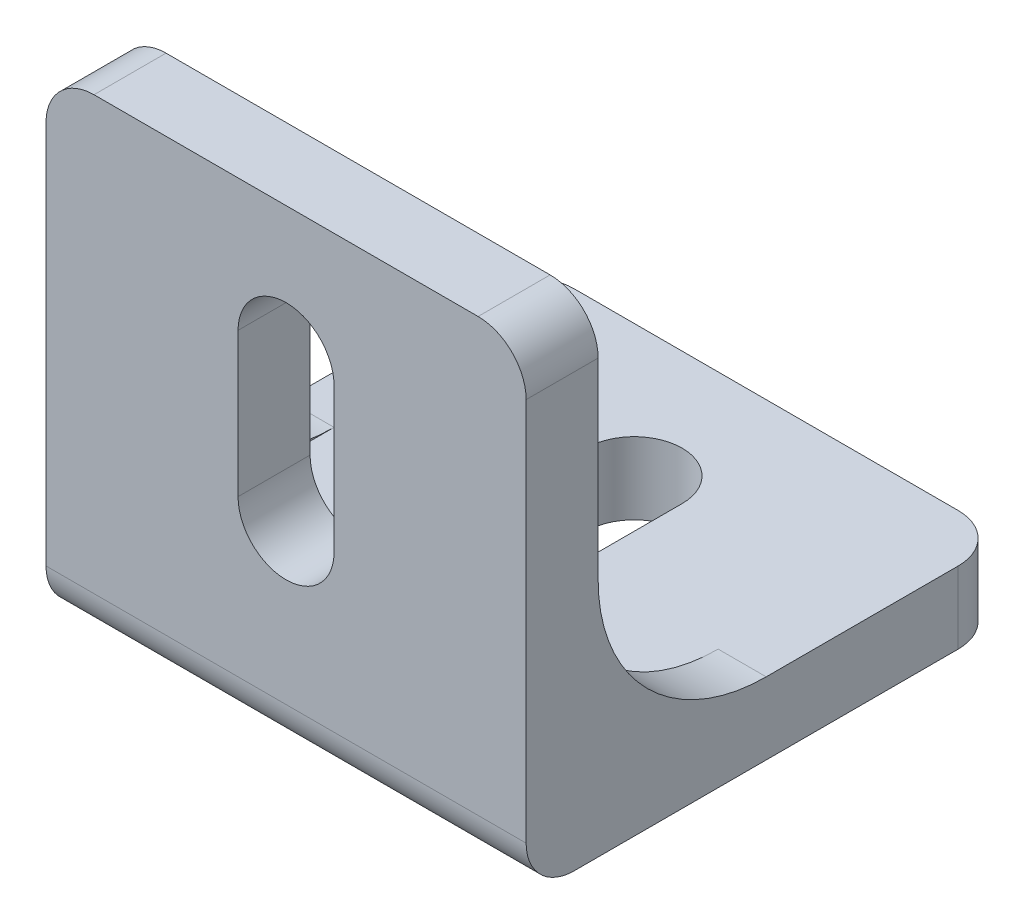
ISO-10303-21;
HEADER;
FILE_DESCRIPTION(('STEP AP214'),'2;1');
FILE_NAME('part.step','',(''),(''),'','','');
FILE_SCHEMA(('AUTOMOTIVE_DESIGN { 1 0 10303 214 1 1 1 1 }'));
ENDSEC;
DATA;
#1=APPLICATION_CONTEXT('core data for automotive mechanical design processes');
#2=APPLICATION_PROTOCOL_DEFINITION('international standard','automotive_design',2000,#1);
#3=PRODUCT_CONTEXT('',#1,'mechanical');
#4=PRODUCT('Part','Part','',(#3));
#5=PRODUCT_RELATED_PRODUCT_CATEGORY('part','',(#4));
#6=PRODUCT_DEFINITION_FORMATION('','',#4);
#7=PRODUCT_DEFINITION_CONTEXT('part definition',#1,'design');
#8=PRODUCT_DEFINITION('design','',#6,#7);
#9=PRODUCT_DEFINITION_SHAPE('','',#8);
#10=(LENGTH_UNIT() NAMED_UNIT(*) SI_UNIT(.MILLI.,.METRE.));
#11=(NAMED_UNIT(*) PLANE_ANGLE_UNIT() SI_UNIT($,.RADIAN.));
#12=(NAMED_UNIT(*) SI_UNIT($,.STERADIAN.) SOLID_ANGLE_UNIT());
#13=UNCERTAINTY_MEASURE_WITH_UNIT(LENGTH_MEASURE(1.E-05),#10,'distance_accuracy_value','');
#14=(GEOMETRIC_REPRESENTATION_CONTEXT(3) GLOBAL_UNCERTAINTY_ASSIGNED_CONTEXT((#13)) GLOBAL_UNIT_ASSIGNED_CONTEXT((#10,
#11,#12)) REPRESENTATION_CONTEXT('',''));
#15=CARTESIAN_POINT('',(0.,0.,0.));
#16=DIRECTION('',(0.,0.,1.));
#17=DIRECTION('',(1.,0.,0.));
#18=AXIS2_PLACEMENT_3D('',#15,#16,#17);
#19=CARTESIAN_POINT('',(-20.,0.,0.));
#20=DIRECTION('',(1.,0.,0.));
#21=DIRECTION('',(0.,0.,-1.));
#22=AXIS2_PLACEMENT_3D('',#19,#20,#21);
#23=CYLINDRICAL_SURFACE('',#22,7.);
#24=CARTESIAN_POINT('',(-18.,0.,0.));
#25=DIRECTION('',(1.,0.,0.));
#26=DIRECTION('',(0.,0.,-1.));
#27=AXIS2_PLACEMENT_3D('',#24,#25,#26);
#28=CIRCLE('',#27,7.);
#29=CARTESIAN_POINT('',(-18.,-7.,0.));
#30=VERTEX_POINT('',#29);
#31=CARTESIAN_POINT('',(-18.,0.,7.));
#32=VERTEX_POINT('',#31);
#33=EDGE_CURVE('E51',#30,#32,#28,.F.);
#34=ORIENTED_EDGE('',*,*,#33,.F.);
#35=DIRECTION('',(1.,0.,0.));
#36=VECTOR('',#35,1.);
#37=CARTESIAN_POINT('',(-20.,-7.,0.));
#38=LINE('',#37,#36);
#39=CARTESIAN_POINT('',(-20.,-7.,0.));
#40=VERTEX_POINT('',#39);
#41=EDGE_CURVE('E355',#40,#30,#38,.T.);
#42=ORIENTED_EDGE('',*,*,#41,.F.);
#43=CARTESIAN_POINT('',(-20.,0.,0.));
#44=DIRECTION('',(1.,0.,0.));
#45=DIRECTION('',(0.,0.,-1.));
#46=AXIS2_PLACEMENT_3D('',#43,#44,#45);
#47=CIRCLE('',#46,7.);
#48=CARTESIAN_POINT('',(-20.,0.,7.));
#49=VERTEX_POINT('',#48);
#50=EDGE_CURVE('E317',#49,#40,#47,.T.);
#51=ORIENTED_EDGE('',*,*,#50,.F.);
#52=DIRECTION('',(1.,0.,0.));
#53=VECTOR('',#52,1.);
#54=CARTESIAN_POINT('',(-20.,0.,7.));
#55=LINE('',#54,#53);
#56=EDGE_CURVE('E360',#49,#32,#55,.T.);
#57=ORIENTED_EDGE('',*,*,#56,.T.);
#58=EDGE_LOOP('',(#34,#42,#51,#57));
#59=FACE_BOUND('',#58,.T.);
#60=ADVANCED_FACE('F42',(#59),#23,.F.);
#61=CARTESIAN_POINT('',(-20.,-10.,10.));
#62=DIRECTION('',(0.,0.,-1.));
#63=DIRECTION('',(-1.,0.,0.));
#64=AXIS2_PLACEMENT_3D('',#61,#62,#63);
#65=PLANE('',#64);
#66=DIRECTION('',(0.,1.,0.));
#67=VECTOR('',#66,1.);
#68=CARTESIAN_POINT('',(-12.,4.5,10.));
#69=LINE('',#68,#67);
#70=CARTESIAN_POINT('',(-12.,-1.5,10.));
#71=VERTEX_POINT('',#70);
#72=CARTESIAN_POINT('',(-12.,4.5,10.));
#73=VERTEX_POINT('',#72);
#74=EDGE_CURVE('E207',#71,#73,#69,.T.);
#75=ORIENTED_EDGE('',*,*,#74,.T.);
#76=CARTESIAN_POINT('',(-10.,4.5,10.));
#77=DIRECTION('',(0.,0.,-1.));
#78=DIRECTION('',(0.,1.,0.));
#79=AXIS2_PLACEMENT_3D('',#76,#77,#78);
#80=CIRCLE('',#79,2.);
#81=CARTESIAN_POINT('',(-8.00000000000001,4.5,10.));
#82=VERTEX_POINT('',#81);
#83=EDGE_CURVE('E200',#73,#82,#80,.T.);
#84=ORIENTED_EDGE('',*,*,#83,.T.);
#85=DIRECTION('',(0.,-1.,0.));
#86=VECTOR('',#85,1.);
#87=CARTESIAN_POINT('',(-8.00000000000001,4.5,10.));
#88=LINE('',#87,#86);
#89=CARTESIAN_POINT('',(-8.00000000000001,-1.5,10.));
#90=VERTEX_POINT('',#89);
#91=EDGE_CURVE('E210',#82,#90,#88,.T.);
#92=ORIENTED_EDGE('',*,*,#91,.T.);
#93=CARTESIAN_POINT('',(-10.,-1.5,10.));
#94=DIRECTION('',(0.,0.,-1.));
#95=DIRECTION('',(0.,1.,0.));
#96=AXIS2_PLACEMENT_3D('',#93,#94,#95);
#97=CIRCLE('',#96,2.);
#98=EDGE_CURVE('E58',#90,#71,#97,.T.);
#99=ORIENTED_EDGE('',*,*,#98,.T.);
#100=EDGE_LOOP('',(#75,#84,#92,#99));
#101=FACE_BOUND('',#100,.T.);
#102=DIRECTION('',(0.,1.,0.));
#103=VECTOR('',#102,1.);
#104=CARTESIAN_POINT('',(-20.,-10.,10.));
#105=LINE('',#104,#103);
#106=CARTESIAN_POINT('',(-20.,-8.,10.));
#107=VERTEX_POINT('',#106);
#108=CARTESIAN_POINT('',(-20.,8.,10.));
#109=VERTEX_POINT('',#108);
#110=EDGE_CURVE('E309',#107,#109,#105,.T.);
#111=ORIENTED_EDGE('',*,*,#110,.F.);
#112=DIRECTION('',(1.,0.,0.));
#113=VECTOR('',#112,1.);
#114=CARTESIAN_POINT('',(0.,-8.,10.));
#115=LINE('',#114,#113);
#116=CARTESIAN_POINT('',(0.,-8.,10.));
#117=VERTEX_POINT('',#116);
#118=EDGE_CURVE('E378',#107,#117,#115,.T.);
#119=ORIENTED_EDGE('',*,*,#118,.T.);
#120=DIRECTION('',(0.,1.,0.));
#121=VECTOR('',#120,1.);
#122=CARTESIAN_POINT('',(0.,-10.,10.));
#123=LINE('',#122,#121);
#124=CARTESIAN_POINT('',(0.,8.,10.));
#125=VERTEX_POINT('',#124);
#126=EDGE_CURVE('E308',#117,#125,#123,.T.);
#127=ORIENTED_EDGE('',*,*,#126,.T.);
#128=CARTESIAN_POINT('',(-2.,8.,10.));
#129=DIRECTION('',(0.,0.,-1.));
#130=DIRECTION('',(-1.,0.,0.));
#131=AXIS2_PLACEMENT_3D('',#128,#129,#130);
#132=CIRCLE('',#131,2.);
#133=CARTESIAN_POINT('',(-2.,10.,10.));
#134=VERTEX_POINT('',#133);
#135=EDGE_CURVE('E372',#125,#134,#132,.F.);
#136=ORIENTED_EDGE('',*,*,#135,.T.);
#137=DIRECTION('',(1.,0.,0.));
#138=VECTOR('',#137,1.);
#139=CARTESIAN_POINT('',(-20.,10.,10.));
#140=LINE('',#139,#138);
#141=CARTESIAN_POINT('',(-18.,10.,10.));
#142=VERTEX_POINT('',#141);
#143=EDGE_CURVE('E368',#142,#134,#140,.T.);
#144=ORIENTED_EDGE('',*,*,#143,.F.);
#145=CARTESIAN_POINT('',(-18.,8.,10.));
#146=DIRECTION('',(0.,0.,-1.));
#147=DIRECTION('',(-1.,0.,0.));
#148=AXIS2_PLACEMENT_3D('',#145,#146,#147);
#149=CIRCLE('',#148,2.);
#150=EDGE_CURVE('E375',#142,#109,#149,.F.);
#151=ORIENTED_EDGE('',*,*,#150,.T.);
#152=EDGE_LOOP('',(#111,#119,#127,#136,#144,#151));
#153=FACE_BOUND('',#152,.T.);
#154=ADVANCED_FACE('F215',(#101,#153),#65,.F.);
#155=CARTESIAN_POINT('',(-20.,10.,10.));
#156=DIRECTION('',(0.,-1.,0.));
#157=DIRECTION('',(0.,0.,-1.));
#158=AXIS2_PLACEMENT_3D('',#155,#156,#157);
#159=PLANE('',#158);
#160=DIRECTION('',(1.,0.,0.));
#161=VECTOR('',#160,1.);
#162=CARTESIAN_POINT('',(-20.,10.,7.));
#163=LINE('',#162,#161);
#164=CARTESIAN_POINT('',(-18.,10.,7.));
#165=VERTEX_POINT('',#164);
#166=CARTESIAN_POINT('',(-2.,10.,7.));
#167=VERTEX_POINT('',#166);
#168=EDGE_CURVE('E364',#165,#167,#163,.T.);
#169=ORIENTED_EDGE('',*,*,#168,.F.);
#170=DIRECTION('',(0.,0.,-1.));
#171=VECTOR('',#170,1.);
#172=CARTESIAN_POINT('',(-18.,10.,10.));
#173=LINE('',#172,#171);
#174=EDGE_CURVE('E434',#165,#142,#173,.F.);
#175=ORIENTED_EDGE('',*,*,#174,.T.);
#176=ORIENTED_EDGE('',*,*,#143,.T.);
#177=DIRECTION('',(0.,0.,-1.));
#178=VECTOR('',#177,1.);
#179=CARTESIAN_POINT('',(-2.,10.,7.));
#180=LINE('',#179,#178);
#181=EDGE_CURVE('E430',#134,#167,#180,.T.);
#182=ORIENTED_EDGE('',*,*,#181,.T.);
#183=EDGE_LOOP('',(#169,#175,#176,#182));
#184=FACE_BOUND('',#183,.T.);
#185=ADVANCED_FACE('F459',(#184),#159,.F.);
#186=CARTESIAN_POINT('',(-20.,10.,7.));
#187=DIRECTION('',(0.,0.,1.));
#188=DIRECTION('',(0.,-1.,0.));
#189=AXIS2_PLACEMENT_3D('',#186,#187,#188);
#190=PLANE('',#189);
#191=DIRECTION('',(0.,-1.,0.));
#192=VECTOR('',#191,1.);
#193=CARTESIAN_POINT('',(-8.00000000000001,4.5,7.));
#194=LINE('',#193,#192);
#195=CARTESIAN_POINT('',(-8.00000000000001,4.5,7.));
#196=VERTEX_POINT('',#195);
#197=CARTESIAN_POINT('',(-8.00000000000001,-1.5,7.));
#198=VERTEX_POINT('',#197);
#199=EDGE_CURVE('E232',#196,#198,#194,.T.);
#200=ORIENTED_EDGE('',*,*,#199,.F.);
#201=CARTESIAN_POINT('',(-10.,4.5,7.));
#202=DIRECTION('',(0.,0.,-1.));
#203=DIRECTION('',(0.,1.,0.));
#204=AXIS2_PLACEMENT_3D('',#201,#202,#203);
#205=CIRCLE('',#204,2.);
#206=CARTESIAN_POINT('',(-12.,4.5,7.));
#207=VERTEX_POINT('',#206);
#208=EDGE_CURVE('E66',#207,#196,#205,.T.);
#209=ORIENTED_EDGE('',*,*,#208,.F.);
#210=DIRECTION('',(0.,1.,0.));
#211=VECTOR('',#210,1.);
#212=CARTESIAN_POINT('',(-12.,4.5,7.));
#213=LINE('',#212,#211);
#214=CARTESIAN_POINT('',(-12.,-1.5,7.));
#215=VERTEX_POINT('',#214);
#216=EDGE_CURVE('E219',#215,#207,#213,.T.);
#217=ORIENTED_EDGE('',*,*,#216,.F.);
#218=CARTESIAN_POINT('',(-10.,-1.5,7.));
#219=DIRECTION('',(0.,0.,-1.));
#220=DIRECTION('',(0.,1.,0.));
#221=AXIS2_PLACEMENT_3D('',#218,#219,#220);
#222=CIRCLE('',#221,2.);
#223=EDGE_CURVE('E223',#198,#215,#222,.T.);
#224=ORIENTED_EDGE('',*,*,#223,.F.);
#225=EDGE_LOOP('',(#200,#209,#217,#224));
#226=FACE_BOUND('',#225,.T.);
#227=DIRECTION('',(0.,-1.,0.));
#228=VECTOR('',#227,1.);
#229=CARTESIAN_POINT('',(-20.,10.,7.));
#230=LINE('',#229,#228);
#231=CARTESIAN_POINT('',(-20.,8.,7.));
#232=VERTEX_POINT('',#231);
#233=EDGE_CURVE('E313',#232,#49,#230,.T.);
#234=ORIENTED_EDGE('',*,*,#233,.F.);
#235=CARTESIAN_POINT('',(-18.,8.,7.));
#236=DIRECTION('',(0.,0.,1.));
#237=DIRECTION('',(0.,-1.,0.));
#238=AXIS2_PLACEMENT_3D('',#235,#236,#237);
#239=CIRCLE('',#238,2.);
#240=EDGE_CURVE('E427',#232,#165,#239,.F.);
#241=ORIENTED_EDGE('',*,*,#240,.T.);
#242=ORIENTED_EDGE('',*,*,#168,.T.);
#243=CARTESIAN_POINT('',(-2.,8.,7.));
#244=DIRECTION('',(0.,0.,1.));
#245=DIRECTION('',(0.,-1.,0.));
#246=AXIS2_PLACEMENT_3D('',#243,#244,#245);
#247=CIRCLE('',#246,2.);
#248=CARTESIAN_POINT('',(0.,8.,7.));
#249=VERTEX_POINT('',#248);
#250=EDGE_CURVE('E424',#167,#249,#247,.F.);
#251=ORIENTED_EDGE('',*,*,#250,.T.);
#252=DIRECTION('',(0.,-1.,0.));
#253=VECTOR('',#252,1.);
#254=CARTESIAN_POINT('',(0.,10.,7.));
#255=LINE('',#254,#253);
#256=CARTESIAN_POINT('',(0.,0.,7.));
#257=VERTEX_POINT('',#256);
#258=EDGE_CURVE('E332',#249,#257,#255,.T.);
#259=ORIENTED_EDGE('',*,*,#258,.T.);
#260=CARTESIAN_POINT('',(-2.00000000000001,0.,7.));
#261=VERTEX_POINT('',#260);
#262=EDGE_CURVE('E359',#261,#257,#55,.T.);
#263=ORIENTED_EDGE('',*,*,#262,.F.);
#264=DIRECTION('',(0.,1.,0.));
#265=VECTOR('',#264,1.);
#266=CARTESIAN_POINT('',(-2.00000000000001,0.,7.));
#267=LINE('',#266,#265);
#268=CARTESIAN_POINT('',(-2.00000000000001,-7.,7.));
#269=VERTEX_POINT('',#268);
#270=EDGE_CURVE('E295',#269,#261,#267,.T.);
#271=ORIENTED_EDGE('',*,*,#270,.F.);
#272=DIRECTION('',(-1.,0.,0.));
#273=VECTOR('',#272,1.);
#274=CARTESIAN_POINT('',(-2.00000000000001,-7.,7.));
#275=LINE('',#274,#273);
#276=CARTESIAN_POINT('',(-18.,-7.,7.));
#277=VERTEX_POINT('',#276);
#278=EDGE_CURVE('E299',#269,#277,#275,.T.);
#279=ORIENTED_EDGE('',*,*,#278,.T.);
#280=DIRECTION('',(0.,1.,0.));
#281=VECTOR('',#280,1.);
#282=CARTESIAN_POINT('',(-18.,0.,7.));
#283=LINE('',#282,#281);
#284=EDGE_CURVE('E296',#277,#32,#283,.T.);
#285=ORIENTED_EDGE('',*,*,#284,.T.);
#286=ORIENTED_EDGE('',*,*,#56,.F.);
#287=EDGE_LOOP('',(#234,#241,#242,#251,#259,#263,#271,#279,#285,#286));
#288=FACE_BOUND('',#287,.T.);
#289=ADVANCED_FACE('F446',(#226,#288),#190,.F.);
#290=CARTESIAN_POINT('',(-2.00000000000001,-7.,0.));
#291=VERTEX_POINT('',#290);
#292=CARTESIAN_POINT('',(0.,-7.,0.));
#293=VERTEX_POINT('',#292);
#294=EDGE_CURVE('E354',#291,#293,#38,.T.);
#295=ORIENTED_EDGE('',*,*,#294,.F.);
#296=CARTESIAN_POINT('',(-2.00000000000001,0.,0.));
#297=DIRECTION('',(1.,0.,0.));
#298=DIRECTION('',(0.,0.,-1.));
#299=AXIS2_PLACEMENT_3D('',#296,#297,#298);
#300=CIRCLE('',#299,7.);
#301=EDGE_CURVE('E11',#291,#261,#300,.F.);
#302=ORIENTED_EDGE('',*,*,#301,.T.);
#303=ORIENTED_EDGE('',*,*,#262,.T.);
#304=CARTESIAN_POINT('',(0.,0.,0.));
#305=DIRECTION('',(1.,0.,0.));
#306=DIRECTION('',(0.,0.,-1.));
#307=AXIS2_PLACEMENT_3D('',#304,#305,#306);
#308=CIRCLE('',#307,7.);
#309=EDGE_CURVE('E336',#257,#293,#308,.T.);
#310=ORIENTED_EDGE('',*,*,#309,.T.);
#311=EDGE_LOOP('',(#295,#302,#303,#310));
#312=FACE_BOUND('',#311,.T.);
#313=ADVANCED_FACE('F483',(#312),#23,.F.);
#314=CARTESIAN_POINT('',(-20.,-7.,0.));
#315=DIRECTION('',(0.,-1.,0.));
#316=DIRECTION('',(0.,0.,-1.));
#317=AXIS2_PLACEMENT_3D('',#314,#315,#316);
#318=PLANE('',#317);
#319=DIRECTION('',(0.,0.,-1.));
#320=VECTOR('',#319,1.);
#321=CARTESIAN_POINT('',(-8.00000000000001,-7.,-4.5));
#322=LINE('',#321,#320);
#323=CARTESIAN_POINT('',(-8.00000000000001,-7.,1.5));
#324=VERTEX_POINT('',#323);
#325=CARTESIAN_POINT('',(-8.00000000000001,-7.,-4.5));
#326=VERTEX_POINT('',#325);
#327=EDGE_CURVE('E267',#324,#326,#322,.T.);
#328=ORIENTED_EDGE('',*,*,#327,.F.);
#329=CARTESIAN_POINT('',(-10.,-7.,1.5));
#330=DIRECTION('',(0.,1.,0.));
#331=DIRECTION('',(0.,0.,1.));
#332=AXIS2_PLACEMENT_3D('',#329,#330,#331);
#333=CIRCLE('',#332,2.);
#334=CARTESIAN_POINT('',(-12.,-7.,1.5));
#335=VERTEX_POINT('',#334);
#336=EDGE_CURVE('E241',#335,#324,#333,.T.);
#337=ORIENTED_EDGE('',*,*,#336,.F.);
#338=DIRECTION('',(0.,0.,1.));
#339=VECTOR('',#338,1.);
#340=CARTESIAN_POINT('',(-12.,-7.,-4.5));
#341=LINE('',#340,#339);
#342=CARTESIAN_POINT('',(-12.,-7.,-4.5));
#343=VERTEX_POINT('',#342);
#344=EDGE_CURVE('E252',#343,#335,#341,.T.);
#345=ORIENTED_EDGE('',*,*,#344,.F.);
#346=CARTESIAN_POINT('',(-10.,-7.,-4.5));
#347=DIRECTION('',(0.,1.,0.));
#348=DIRECTION('',(0.,0.,-1.));
#349=AXIS2_PLACEMENT_3D('',#346,#347,#348);
#350=CIRCLE('',#349,2.);
#351=EDGE_CURVE('E271',#326,#343,#350,.T.);
#352=ORIENTED_EDGE('',*,*,#351,.F.);
#353=EDGE_LOOP('',(#328,#337,#345,#352));
#354=FACE_BOUND('',#353,.T.);
#355=DIRECTION('',(1.,0.,0.));
#356=VECTOR('',#355,1.);
#357=CARTESIAN_POINT('',(-20.,-7.,-10.));
#358=LINE('',#357,#356);
#359=CARTESIAN_POINT('',(-18.,-7.,-10.));
#360=VERTEX_POINT('',#359);
#361=CARTESIAN_POINT('',(-2.,-7.,-10.));
#362=VERTEX_POINT('',#361);
#363=EDGE_CURVE('E350',#360,#362,#358,.T.);
#364=ORIENTED_EDGE('',*,*,#363,.F.);
#365=CARTESIAN_POINT('',(-18.,-7.,-8.));
#366=DIRECTION('',(0.,-1.,0.));
#367=DIRECTION('',(0.,0.,-1.));
#368=AXIS2_PLACEMENT_3D('',#365,#366,#367);
#369=CIRCLE('',#368,2.);
#370=CARTESIAN_POINT('',(-20.,-7.,-8.));
#371=VERTEX_POINT('',#370);
#372=EDGE_CURVE('E421',#360,#371,#369,.F.);
#373=ORIENTED_EDGE('',*,*,#372,.T.);
#374=DIRECTION('',(0.,0.,-1.));
#375=VECTOR('',#374,1.);
#376=CARTESIAN_POINT('',(-20.,-7.,0.));
#377=LINE('',#376,#375);
#378=EDGE_CURVE('E320',#40,#371,#377,.T.);
#379=ORIENTED_EDGE('',*,*,#378,.F.);
#380=ORIENTED_EDGE('',*,*,#41,.T.);
#381=DIRECTION('',(0.,0.,1.));
#382=VECTOR('',#381,1.);
#383=CARTESIAN_POINT('',(-18.,-7.,7.));
#384=LINE('',#383,#382);
#385=EDGE_CURVE('E281',#30,#277,#384,.T.);
#386=ORIENTED_EDGE('',*,*,#385,.T.);
#387=ORIENTED_EDGE('',*,*,#278,.F.);
#388=DIRECTION('',(0.,0.,1.));
#389=VECTOR('',#388,1.);
#390=CARTESIAN_POINT('',(-2.00000000000001,-7.,7.));
#391=LINE('',#390,#389);
#392=EDGE_CURVE('E291',#291,#269,#391,.T.);
#393=ORIENTED_EDGE('',*,*,#392,.F.);
#394=ORIENTED_EDGE('',*,*,#294,.T.);
#395=DIRECTION('',(0.,0.,-1.));
#396=VECTOR('',#395,1.);
#397=CARTESIAN_POINT('',(0.,-7.,0.));
#398=LINE('',#397,#396);
#399=CARTESIAN_POINT('',(0.,-7.,-8.));
#400=VERTEX_POINT('',#399);
#401=EDGE_CURVE('E340',#293,#400,#398,.T.);
#402=ORIENTED_EDGE('',*,*,#401,.T.);
#403=CARTESIAN_POINT('',(-2.,-7.,-8.));
#404=DIRECTION('',(0.,-1.,0.));
#405=DIRECTION('',(0.,0.,-1.));
#406=AXIS2_PLACEMENT_3D('',#403,#404,#405);
#407=CIRCLE('',#406,2.);
#408=EDGE_CURVE('E418',#400,#362,#407,.F.);
#409=ORIENTED_EDGE('',*,*,#408,.T.);
#410=EDGE_LOOP('',(#364,#373,#379,#380,#386,#387,#393,#394,#402,#409));
#411=FACE_BOUND('',#410,.T.);
#412=ADVANCED_FACE('F489',(#354,#411),#318,.F.);
#413=CARTESIAN_POINT('',(-20.,-10.,-10.));
#414=DIRECTION('',(0.,0.,-1.));
#415=DIRECTION('',(-1.,0.,0.));
#416=AXIS2_PLACEMENT_3D('',#413,#414,#415);
#417=PLANE('',#416);
#418=DIRECTION('',(1.,0.,0.));
#419=VECTOR('',#418,1.);
#420=CARTESIAN_POINT('',(-20.,-10.,-10.));
#421=LINE('',#420,#419);
#422=CARTESIAN_POINT('',(-18.,-10.,-10.));
#423=VERTEX_POINT('',#422);
#424=CARTESIAN_POINT('',(-2.,-10.,-10.));
#425=VERTEX_POINT('',#424);
#426=EDGE_CURVE('E328',#423,#425,#421,.T.);
#427=ORIENTED_EDGE('',*,*,#426,.F.);
#428=DIRECTION('',(0.,1.,0.));
#429=VECTOR('',#428,1.);
#430=CARTESIAN_POINT('',(-18.,-7.,-10.));
#431=LINE('',#430,#429);
#432=EDGE_CURVE('E414',#423,#360,#431,.T.);
#433=ORIENTED_EDGE('',*,*,#432,.T.);
#434=ORIENTED_EDGE('',*,*,#363,.T.);
#435=DIRECTION('',(0.,1.,0.));
#436=VECTOR('',#435,1.);
#437=CARTESIAN_POINT('',(-2.,-10.,-10.));
#438=LINE('',#437,#436);
#439=EDGE_CURVE('E411',#362,#425,#438,.F.);
#440=ORIENTED_EDGE('',*,*,#439,.T.);
#441=EDGE_LOOP('',(#427,#433,#434,#440));
#442=FACE_BOUND('',#441,.T.);
#443=ADVANCED_FACE('F515',(#442),#417,.T.);
#444=CARTESIAN_POINT('',(-20.,-10.,10.));
#445=DIRECTION('',(0.,-1.,0.));
#446=DIRECTION('',(0.,0.,-1.));
#447=AXIS2_PLACEMENT_3D('',#444,#445,#446);
#448=PLANE('',#447);
#449=CARTESIAN_POINT('',(-10.,-10.,1.5));
#450=DIRECTION('',(0.,1.,0.));
#451=DIRECTION('',(0.,0.,1.));
#452=AXIS2_PLACEMENT_3D('',#449,#450,#451);
#453=CIRCLE('',#452,2.);
#454=CARTESIAN_POINT('',(-12.,-10.,1.5));
#455=VERTEX_POINT('',#454);
#456=CARTESIAN_POINT('',(-8.00000000000001,-10.,1.5));
#457=VERTEX_POINT('',#456);
#458=EDGE_CURVE('E247',#455,#457,#453,.T.);
#459=ORIENTED_EDGE('',*,*,#458,.T.);
#460=DIRECTION('',(0.,0.,-1.));
#461=VECTOR('',#460,1.);
#462=CARTESIAN_POINT('',(-8.00000000000001,-10.,-4.5));
#463=LINE('',#462,#461);
#464=CARTESIAN_POINT('',(-8.00000000000001,-10.,-4.5));
#465=VERTEX_POINT('',#464);
#466=EDGE_CURVE('E251',#457,#465,#463,.T.);
#467=ORIENTED_EDGE('',*,*,#466,.T.);
#468=CARTESIAN_POINT('',(-10.,-10.,-4.5));
#469=DIRECTION('',(0.,1.,0.));
#470=DIRECTION('',(0.,0.,-1.));
#471=AXIS2_PLACEMENT_3D('',#468,#469,#470);
#472=CIRCLE('',#471,2.);
#473=CARTESIAN_POINT('',(-12.,-10.,-4.5));
#474=VERTEX_POINT('',#473);
#475=EDGE_CURVE('E256',#465,#474,#472,.T.);
#476=ORIENTED_EDGE('',*,*,#475,.T.);
#477=DIRECTION('',(0.,0.,1.));
#478=VECTOR('',#477,1.);
#479=CARTESIAN_POINT('',(-12.,-10.,-4.5));
#480=LINE('',#479,#478);
#481=EDGE_CURVE('E260',#474,#455,#480,.T.);
#482=ORIENTED_EDGE('',*,*,#481,.T.);
#483=EDGE_LOOP('',(#459,#467,#476,#482));
#484=FACE_BOUND('',#483,.T.);
#485=DIRECTION('',(0.,0.,-1.));
#486=VECTOR('',#485,1.);
#487=CARTESIAN_POINT('',(0.,-10.,10.));
#488=LINE('',#487,#486);
#489=CARTESIAN_POINT('',(0.,-10.,8.));
#490=VERTEX_POINT('',#489);
#491=CARTESIAN_POINT('',(0.,-10.,-8.));
#492=VERTEX_POINT('',#491);
#493=EDGE_CURVE('E314',#490,#492,#488,.T.);
#494=ORIENTED_EDGE('',*,*,#493,.F.);
#495=DIRECTION('',(1.,0.,0.));
#496=VECTOR('',#495,1.);
#497=CARTESIAN_POINT('',(-20.,-10.,8.));
#498=LINE('',#497,#496);
#499=CARTESIAN_POINT('',(-20.,-10.,8.));
#500=VERTEX_POINT('',#499);
#501=EDGE_CURVE('E398',#490,#500,#498,.F.);
#502=ORIENTED_EDGE('',*,*,#501,.T.);
#503=DIRECTION('',(0.,0.,-1.));
#504=VECTOR('',#503,1.);
#505=CARTESIAN_POINT('',(-20.,-10.,10.));
#506=LINE('',#505,#504);
#507=CARTESIAN_POINT('',(-20.,-10.,-8.));
#508=VERTEX_POINT('',#507);
#509=EDGE_CURVE('E324',#500,#508,#506,.T.);
#510=ORIENTED_EDGE('',*,*,#509,.T.);
#511=CARTESIAN_POINT('',(-18.,-10.,-8.));
#512=DIRECTION('',(0.,-1.,0.));
#513=DIRECTION('',(0.,0.,-1.));
#514=AXIS2_PLACEMENT_3D('',#511,#512,#513);
#515=CIRCLE('',#514,2.);
#516=EDGE_CURVE('E395',#508,#423,#515,.T.);
#517=ORIENTED_EDGE('',*,*,#516,.T.);
#518=ORIENTED_EDGE('',*,*,#426,.T.);
#519=CARTESIAN_POINT('',(-2.,-10.,-8.));
#520=DIRECTION('',(0.,-1.,0.));
#521=DIRECTION('',(0.,0.,-1.));
#522=AXIS2_PLACEMENT_3D('',#519,#520,#521);
#523=CIRCLE('',#522,2.);
#524=EDGE_CURVE('E392',#425,#492,#523,.T.);
#525=ORIENTED_EDGE('',*,*,#524,.T.);
#526=EDGE_LOOP('',(#494,#502,#510,#517,#518,#525));
#527=FACE_BOUND('',#526,.T.);
#528=ADVANCED_FACE('F538',(#484,#527),#448,.T.);
#529=CARTESIAN_POINT('',(-20.,0.,0.));
#530=DIRECTION('',(1.,0.,0.));
#531=DIRECTION('',(0.,0.,-1.));
#532=AXIS2_PLACEMENT_3D('',#529,#530,#531);
#533=PLANE('',#532);
#534=ORIENTED_EDGE('',*,*,#509,.F.);
#535=CARTESIAN_POINT('',(-20.,-8.,8.));
#536=DIRECTION('',(1.,0.,0.));
#537=DIRECTION('',(0.,0.,-1.));
#538=AXIS2_PLACEMENT_3D('',#535,#536,#537);
#539=CIRCLE('',#538,2.);
#540=EDGE_CURVE('E408',#500,#107,#539,.F.);
#541=ORIENTED_EDGE('',*,*,#540,.T.);
#542=ORIENTED_EDGE('',*,*,#110,.T.);
#543=DIRECTION('',(0.,0.,-1.));
#544=VECTOR('',#543,1.);
#545=CARTESIAN_POINT('',(-20.,8.,0.));
#546=LINE('',#545,#544);
#547=EDGE_CURVE('E401',#109,#232,#546,.T.);
#548=ORIENTED_EDGE('',*,*,#547,.T.);
#549=ORIENTED_EDGE('',*,*,#233,.T.);
#550=ORIENTED_EDGE('',*,*,#50,.T.);
#551=ORIENTED_EDGE('',*,*,#378,.T.);
#552=DIRECTION('',(0.,1.,0.));
#553=VECTOR('',#552,1.);
#554=CARTESIAN_POINT('',(-20.,-10.,-8.));
#555=LINE('',#554,#553);
#556=EDGE_CURVE('E405',#371,#508,#555,.F.);
#557=ORIENTED_EDGE('',*,*,#556,.T.);
#558=EDGE_LOOP('',(#534,#541,#542,#548,#549,#550,#551,#557));
#559=FACE_BOUND('',#558,.T.);
#560=ADVANCED_FACE('F452',(#559),#533,.F.);
#561=CARTESIAN_POINT('',(0.,0.,0.));
#562=DIRECTION('',(1.,0.,0.));
#563=DIRECTION('',(0.,0.,-1.));
#564=AXIS2_PLACEMENT_3D('',#561,#562,#563);
#565=PLANE('',#564);
#566=ORIENTED_EDGE('',*,*,#126,.F.);
#567=CARTESIAN_POINT('',(0.,-8.,8.));
#568=DIRECTION('',(1.,0.,0.));
#569=DIRECTION('',(0.,0.,-1.));
#570=AXIS2_PLACEMENT_3D('',#567,#568,#569);
#571=CIRCLE('',#570,2.);
#572=EDGE_CURVE('E389',#117,#490,#571,.T.);
#573=ORIENTED_EDGE('',*,*,#572,.T.);
#574=ORIENTED_EDGE('',*,*,#493,.T.);
#575=DIRECTION('',(0.,1.,0.));
#576=VECTOR('',#575,1.);
#577=CARTESIAN_POINT('',(0.,0.,-8.));
#578=LINE('',#577,#576);
#579=EDGE_CURVE('E385',#492,#400,#578,.T.);
#580=ORIENTED_EDGE('',*,*,#579,.T.);
#581=ORIENTED_EDGE('',*,*,#401,.F.);
#582=ORIENTED_EDGE('',*,*,#309,.F.);
#583=ORIENTED_EDGE('',*,*,#258,.F.);
#584=DIRECTION('',(0.,0.,-1.));
#585=VECTOR('',#584,1.);
#586=CARTESIAN_POINT('',(0.,8.,10.));
#587=LINE('',#586,#585);
#588=EDGE_CURVE('E382',#249,#125,#587,.F.);
#589=ORIENTED_EDGE('',*,*,#588,.T.);
#590=EDGE_LOOP('',(#566,#573,#574,#580,#581,#582,#583,#589));
#591=FACE_BOUND('',#590,.T.);
#592=ADVANCED_FACE('F473',(#591),#565,.T.);
#593=CARTESIAN_POINT('',(-20.,-8.,8.));
#594=DIRECTION('',(-1.,0.,0.));
#595=DIRECTION('',(0.,0.,1.));
#596=AXIS2_PLACEMENT_3D('',#593,#594,#595);
#597=CYLINDRICAL_SURFACE('',#596,2.);
#598=ORIENTED_EDGE('',*,*,#540,.F.);
#599=ORIENTED_EDGE('',*,*,#501,.F.);
#600=ORIENTED_EDGE('',*,*,#572,.F.);
#601=ORIENTED_EDGE('',*,*,#118,.F.);
#602=EDGE_LOOP('',(#598,#599,#600,#601));
#603=FACE_BOUND('',#602,.T.);
#604=ADVANCED_FACE('F469',(#603),#597,.T.);
#605=CARTESIAN_POINT('',(-18.,-10.,-8.));
#606=DIRECTION('',(0.,-1.,0.));
#607=DIRECTION('',(0.,0.,-1.));
#608=AXIS2_PLACEMENT_3D('',#605,#606,#607);
#609=CYLINDRICAL_SURFACE('',#608,2.);
#610=ORIENTED_EDGE('',*,*,#516,.F.);
#611=ORIENTED_EDGE('',*,*,#556,.F.);
#612=ORIENTED_EDGE('',*,*,#372,.F.);
#613=ORIENTED_EDGE('',*,*,#432,.F.);
#614=EDGE_LOOP('',(#610,#611,#612,#613));
#615=FACE_BOUND('',#614,.T.);
#616=ADVANCED_FACE('F525',(#615),#609,.T.);
#617=CARTESIAN_POINT('',(-18.,8.,0.));
#618=DIRECTION('',(0.,0.,-1.));
#619=DIRECTION('',(0.,1.,0.));
#620=AXIS2_PLACEMENT_3D('',#617,#618,#619);
#621=CYLINDRICAL_SURFACE('',#620,2.);
#622=ORIENTED_EDGE('',*,*,#150,.F.);
#623=ORIENTED_EDGE('',*,*,#174,.F.);
#624=ORIENTED_EDGE('',*,*,#240,.F.);
#625=ORIENTED_EDGE('',*,*,#547,.F.);
#626=EDGE_LOOP('',(#622,#623,#624,#625));
#627=FACE_BOUND('',#626,.T.);
#628=ADVANCED_FACE('F463',(#627),#621,.T.);
#629=CARTESIAN_POINT('',(-2.,0.,-8.));
#630=DIRECTION('',(0.,1.,0.));
#631=DIRECTION('',(0.,0.,1.));
#632=AXIS2_PLACEMENT_3D('',#629,#630,#631);
#633=CYLINDRICAL_SURFACE('',#632,2.);
#634=ORIENTED_EDGE('',*,*,#524,.F.);
#635=ORIENTED_EDGE('',*,*,#439,.F.);
#636=ORIENTED_EDGE('',*,*,#408,.F.);
#637=ORIENTED_EDGE('',*,*,#579,.F.);
#638=EDGE_LOOP('',(#634,#635,#636,#637));
#639=FACE_BOUND('',#638,.T.);
#640=ADVANCED_FACE('F500',(#639),#633,.T.);
#641=CARTESIAN_POINT('',(-2.,8.,10.));
#642=DIRECTION('',(0.,0.,1.));
#643=DIRECTION('',(0.,-1.,0.));
#644=AXIS2_PLACEMENT_3D('',#641,#642,#643);
#645=CYLINDRICAL_SURFACE('',#644,2.);
#646=ORIENTED_EDGE('',*,*,#135,.F.);
#647=ORIENTED_EDGE('',*,*,#588,.F.);
#648=ORIENTED_EDGE('',*,*,#250,.F.);
#649=ORIENTED_EDGE('',*,*,#181,.F.);
#650=EDGE_LOOP('',(#646,#647,#648,#649));
#651=FACE_BOUND('',#650,.T.);
#652=ADVANCED_FACE('F44',(#651),#645,.T.);
#653=CARTESIAN_POINT('',(-2.00000000000001,0.,0.));
#654=DIRECTION('',(1.,0.,0.));
#655=DIRECTION('',(0.,0.,-1.));
#656=AXIS2_PLACEMENT_3D('',#653,#654,#655);
#657=PLANE('',#656);
#658=ORIENTED_EDGE('',*,*,#392,.T.);
#659=ORIENTED_EDGE('',*,*,#270,.T.);
#660=ORIENTED_EDGE('',*,*,#301,.F.);
#661=EDGE_LOOP('',(#658,#659,#660));
#662=FACE_BOUND('',#661,.T.);
#663=ADVANCED_FACE('F491',(#662),#657,.F.);
#664=CARTESIAN_POINT('',(-18.,0.,0.));
#665=DIRECTION('',(1.,0.,0.));
#666=DIRECTION('',(0.,0.,-1.));
#667=AXIS2_PLACEMENT_3D('',#664,#665,#666);
#668=PLANE('',#667);
#669=ORIENTED_EDGE('',*,*,#33,.T.);
#670=ORIENTED_EDGE('',*,*,#284,.F.);
#671=ORIENTED_EDGE('',*,*,#385,.F.);
#672=EDGE_LOOP('',(#669,#670,#671));
#673=FACE_BOUND('',#672,.T.);
#674=ADVANCED_FACE('F440',(#673),#668,.T.);
#675=CARTESIAN_POINT('',(-10.,-10.,1.5));
#676=DIRECTION('',(0.,1.,0.));
#677=DIRECTION('',(0.,0.,1.));
#678=AXIS2_PLACEMENT_3D('',#675,#676,#677);
#679=CYLINDRICAL_SURFACE('',#678,2.);
#680=ORIENTED_EDGE('',*,*,#336,.T.);
#681=DIRECTION('',(0.,1.,0.));
#682=VECTOR('',#681,1.);
#683=CARTESIAN_POINT('',(-8.00000000000001,-10.,1.5));
#684=LINE('',#683,#682);
#685=EDGE_CURVE('E264',#457,#324,#684,.T.);
#686=ORIENTED_EDGE('',*,*,#685,.F.);
#687=ORIENTED_EDGE('',*,*,#458,.F.);
#688=DIRECTION('',(0.,1.,0.));
#689=VECTOR('',#688,1.);
#690=CARTESIAN_POINT('',(-12.,-10.,1.5));
#691=LINE('',#690,#689);
#692=EDGE_CURVE('E278',#455,#335,#691,.T.);
#693=ORIENTED_EDGE('',*,*,#692,.T.);
#694=EDGE_LOOP('',(#680,#686,#687,#693));
#695=FACE_BOUND('',#694,.T.);
#696=ADVANCED_FACE('F498',(#695),#679,.F.);
#697=CARTESIAN_POINT('',(-12.,-10.,-4.5));
#698=DIRECTION('',(-1.,0.,0.));
#699=DIRECTION('',(0.,0.,1.));
#700=AXIS2_PLACEMENT_3D('',#697,#698,#699);
#701=PLANE('',#700);
#702=ORIENTED_EDGE('',*,*,#344,.T.);
#703=ORIENTED_EDGE('',*,*,#692,.F.);
#704=ORIENTED_EDGE('',*,*,#481,.F.);
#705=DIRECTION('',(0.,1.,0.));
#706=VECTOR('',#705,1.);
#707=CARTESIAN_POINT('',(-12.,-10.,-4.5));
#708=LINE('',#707,#706);
#709=EDGE_CURVE('E282',#474,#343,#708,.T.);
#710=ORIENTED_EDGE('',*,*,#709,.T.);
#711=EDGE_LOOP('',(#702,#703,#704,#710));
#712=FACE_BOUND('',#711,.T.);
#713=ADVANCED_FACE('F632',(#712),#701,.F.);
#714=CARTESIAN_POINT('',(-10.,-10.,-4.5));
#715=DIRECTION('',(0.,1.,0.));
#716=DIRECTION('',(0.,0.,1.));
#717=AXIS2_PLACEMENT_3D('',#714,#715,#716);
#718=CYLINDRICAL_SURFACE('',#717,2.);
#719=ORIENTED_EDGE('',*,*,#351,.T.);
#720=ORIENTED_EDGE('',*,*,#709,.F.);
#721=ORIENTED_EDGE('',*,*,#475,.F.);
#722=DIRECTION('',(0.,1.,0.));
#723=VECTOR('',#722,1.);
#724=CARTESIAN_POINT('',(-8.00000000000001,-10.,-4.5));
#725=LINE('',#724,#723);
#726=EDGE_CURVE('E285',#465,#326,#725,.T.);
#727=ORIENTED_EDGE('',*,*,#726,.T.);
#728=EDGE_LOOP('',(#719,#720,#721,#727));
#729=FACE_BOUND('',#728,.T.);
#730=ADVANCED_FACE('F642',(#729),#718,.F.);
#731=CARTESIAN_POINT('',(-8.00000000000001,-10.,-4.5));
#732=DIRECTION('',(1.,0.,0.));
#733=DIRECTION('',(0.,0.,-1.));
#734=AXIS2_PLACEMENT_3D('',#731,#732,#733);
#735=PLANE('',#734);
#736=ORIENTED_EDGE('',*,*,#327,.T.);
#737=ORIENTED_EDGE('',*,*,#726,.F.);
#738=ORIENTED_EDGE('',*,*,#466,.F.);
#739=ORIENTED_EDGE('',*,*,#685,.T.);
#740=EDGE_LOOP('',(#736,#737,#738,#739));
#741=FACE_BOUND('',#740,.T.);
#742=ADVANCED_FACE('F653',(#741),#735,.F.);
#743=CARTESIAN_POINT('',(-10.,4.5,10.));
#744=DIRECTION('',(0.,0.,-1.));
#745=DIRECTION('',(0.,1.,0.));
#746=AXIS2_PLACEMENT_3D('',#743,#744,#745);
#747=CYLINDRICAL_SURFACE('',#746,2.);
#748=ORIENTED_EDGE('',*,*,#208,.T.);
#749=DIRECTION('',(0.,0.,-1.));
#750=VECTOR('',#749,1.);
#751=CARTESIAN_POINT('',(-8.00000000000001,4.5,10.));
#752=LINE('',#751,#750);
#753=EDGE_CURVE('E196',#82,#196,#752,.T.);
#754=ORIENTED_EDGE('',*,*,#753,.F.);
#755=ORIENTED_EDGE('',*,*,#83,.F.);
#756=DIRECTION('',(0.,0.,-1.));
#757=VECTOR('',#756,1.);
#758=CARTESIAN_POINT('',(-12.,4.5,10.));
#759=LINE('',#758,#757);
#760=EDGE_CURVE('E238',#73,#207,#759,.T.);
#761=ORIENTED_EDGE('',*,*,#760,.T.);
#762=EDGE_LOOP('',(#748,#754,#755,#761));
#763=FACE_BOUND('',#762,.T.);
#764=ADVANCED_FACE('F198',(#763),#747,.F.);
#765=CARTESIAN_POINT('',(-12.,4.5,10.));
#766=DIRECTION('',(-1.,0.,0.));
#767=DIRECTION('',(0.,0.,1.));
#768=AXIS2_PLACEMENT_3D('',#765,#766,#767);
#769=PLANE('',#768);
#770=ORIENTED_EDGE('',*,*,#216,.T.);
#771=ORIENTED_EDGE('',*,*,#760,.F.);
#772=ORIENTED_EDGE('',*,*,#74,.F.);
#773=DIRECTION('',(0.,0.,-1.));
#774=VECTOR('',#773,1.);
#775=CARTESIAN_POINT('',(-12.,-1.5,10.));
#776=LINE('',#775,#774);
#777=EDGE_CURVE('E242',#71,#215,#776,.T.);
#778=ORIENTED_EDGE('',*,*,#777,.T.);
#779=EDGE_LOOP('',(#770,#771,#772,#778));
#780=FACE_BOUND('',#779,.T.);
#781=ADVANCED_FACE('F685',(#780),#769,.F.);
#782=CARTESIAN_POINT('',(-10.,-1.5,10.));
#783=DIRECTION('',(0.,0.,-1.));
#784=DIRECTION('',(0.,1.,0.));
#785=AXIS2_PLACEMENT_3D('',#782,#783,#784);
#786=CYLINDRICAL_SURFACE('',#785,2.);
#787=ORIENTED_EDGE('',*,*,#223,.T.);
#788=ORIENTED_EDGE('',*,*,#777,.F.);
#789=ORIENTED_EDGE('',*,*,#98,.F.);
#790=DIRECTION('',(0.,0.,-1.));
#791=VECTOR('',#790,1.);
#792=CARTESIAN_POINT('',(-8.00000000000001,-1.5,10.));
#793=LINE('',#792,#791);
#794=EDGE_CURVE('E206',#90,#198,#793,.T.);
#795=ORIENTED_EDGE('',*,*,#794,.T.);
#796=EDGE_LOOP('',(#787,#788,#789,#795));
#797=FACE_BOUND('',#796,.T.);
#798=ADVANCED_FACE('F695',(#797),#786,.F.);
#799=CARTESIAN_POINT('',(-8.00000000000001,4.5,10.));
#800=DIRECTION('',(1.,0.,0.));
#801=DIRECTION('',(0.,0.,-1.));
#802=AXIS2_PLACEMENT_3D('',#799,#800,#801);
#803=PLANE('',#802);
#804=ORIENTED_EDGE('',*,*,#199,.T.);
#805=ORIENTED_EDGE('',*,*,#794,.F.);
#806=ORIENTED_EDGE('',*,*,#91,.F.);
#807=ORIENTED_EDGE('',*,*,#753,.T.);
#808=EDGE_LOOP('',(#804,#805,#806,#807));
#809=FACE_BOUND('',#808,.T.);
#810=ADVANCED_FACE('F211',(#809),#803,.F.);
#811=CLOSED_SHELL('',(#60,#154,#185,#289,#313,#412,#443,#528,#560,#592,#604,#616,#628,#640,#652,
#663,#674,#696,#713,#730,#742,#764,#781,#798,#810));
#812=MANIFOLD_SOLID_BREP('B2',#811);
#813=ADVANCED_BREP_SHAPE_REPRESENTATION('',(#18,#812),#14);
#814=SHAPE_DEFINITION_REPRESENTATION(#9,#813);
ENDSEC;
END-ISO-10303-21;
